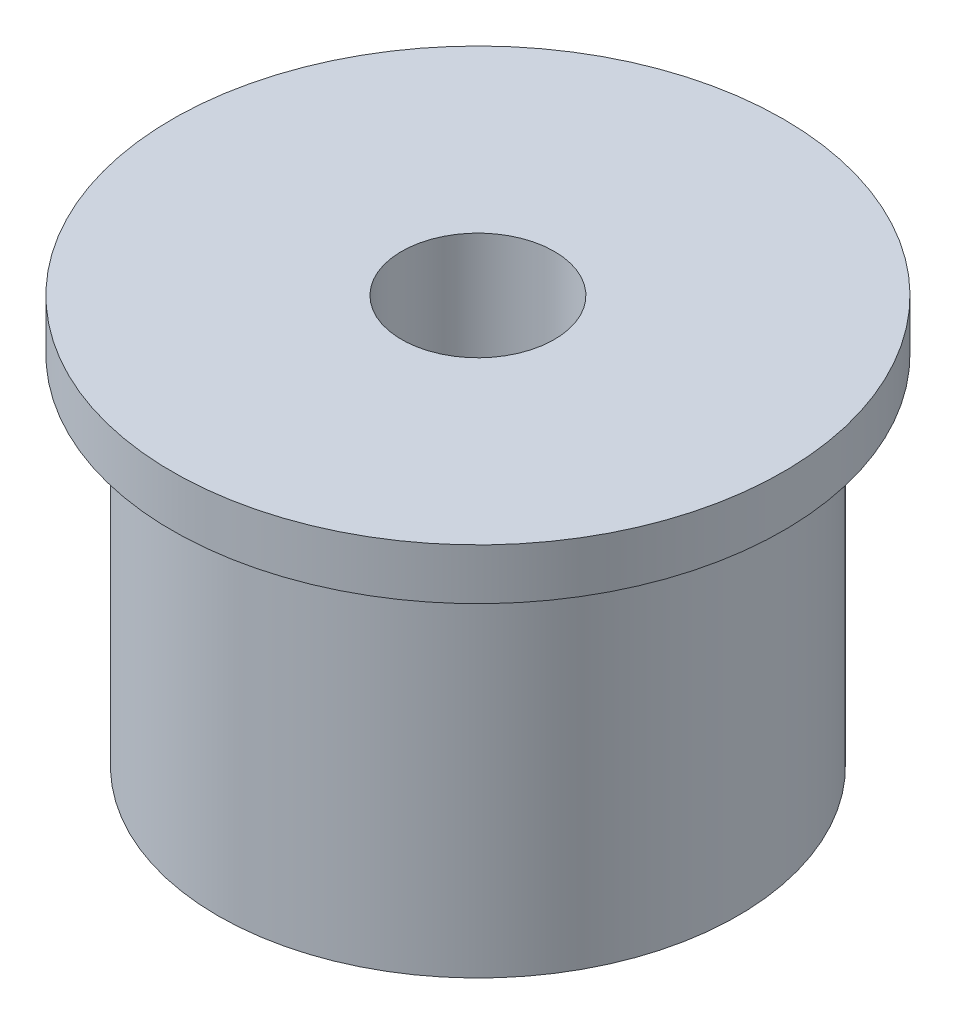
ISO-10303-21;
HEADER;
FILE_DESCRIPTION(('STEP AP214'),'2;1');
FILE_NAME('part.step','',(''),(''),'','','');
FILE_SCHEMA(('AUTOMOTIVE_DESIGN { 1 0 10303 214 1 1 1 1 }'));
ENDSEC;
DATA;
#1=APPLICATION_CONTEXT('core data for automotive mechanical design processes');
#2=APPLICATION_PROTOCOL_DEFINITION('international standard','automotive_design',2000,#1);
#3=PRODUCT_CONTEXT('',#1,'mechanical');
#4=PRODUCT('Part','Part','',(#3));
#5=PRODUCT_RELATED_PRODUCT_CATEGORY('part','',(#4));
#6=PRODUCT_DEFINITION_FORMATION('','',#4);
#7=PRODUCT_DEFINITION_CONTEXT('part definition',#1,'design');
#8=PRODUCT_DEFINITION('design','',#6,#7);
#9=PRODUCT_DEFINITION_SHAPE('','',#8);
#10=(LENGTH_UNIT() NAMED_UNIT(*) SI_UNIT(.MILLI.,.METRE.));
#11=(NAMED_UNIT(*) PLANE_ANGLE_UNIT() SI_UNIT($,.RADIAN.));
#12=(NAMED_UNIT(*) SI_UNIT($,.STERADIAN.) SOLID_ANGLE_UNIT());
#13=UNCERTAINTY_MEASURE_WITH_UNIT(LENGTH_MEASURE(1.E-05),#10,'distance_accuracy_value','');
#14=(GEOMETRIC_REPRESENTATION_CONTEXT(3) GLOBAL_UNCERTAINTY_ASSIGNED_CONTEXT((#13)) GLOBAL_UNIT_ASSIGNED_CONTEXT((#10,
#11,#12)) REPRESENTATION_CONTEXT('',''));
#15=CARTESIAN_POINT('',(0.,0.,0.));
#16=DIRECTION('',(0.,0.,1.));
#17=DIRECTION('',(1.,0.,0.));
#18=AXIS2_PLACEMENT_3D('',#15,#16,#17);
#19=CARTESIAN_POINT('',(-16.2052,0.,0.));
#20=DIRECTION('',(0.,1.,0.));
#21=DIRECTION('',(0.,0.,1.));
#22=AXIS2_PLACEMENT_3D('',#19,#20,#21);
#23=PLANE('',#22);
#24=CARTESIAN_POINT('',(0.,0.,0.));
#25=DIRECTION('',(0.,-1.,0.));
#26=DIRECTION('',(0.,0.,-1.));
#27=AXIS2_PLACEMENT_3D('',#24,#25,#26);
#28=CIRCLE('',#27,4.7625);
#29=CARTESIAN_POINT('',(0.,0.,-4.7625));
#30=VERTEX_POINT('',#29);
#31=EDGE_CURVE('E10',#30,#30,#28,.T.);
#32=ORIENTED_EDGE('',*,*,#31,.F.);
#33=EDGE_LOOP('',(#32));
#34=FACE_BOUND('',#33,.T.);
#35=CARTESIAN_POINT('',(0.,0.,0.));
#36=DIRECTION('',(0.,-1.,0.));
#37=DIRECTION('',(0.,0.,-1.));
#38=AXIS2_PLACEMENT_3D('',#35,#36,#37);
#39=CIRCLE('',#38,16.2052);
#40=CARTESIAN_POINT('',(0.,0.,-16.2052));
#41=VERTEX_POINT('',#40);
#42=EDGE_CURVE('E53',#41,#41,#39,.T.);
#43=ORIENTED_EDGE('',*,*,#42,.T.);
#44=EDGE_LOOP('',(#43));
#45=FACE_BOUND('',#44,.T.);
#46=ADVANCED_FACE('F31',(#34,#45),#23,.F.);
#47=CARTESIAN_POINT('',(0.,0.,0.));
#48=DIRECTION('',(0.,-1.,0.));
#49=DIRECTION('',(0.,0.,-1.));
#50=AXIS2_PLACEMENT_3D('',#47,#48,#49);
#51=CYLINDRICAL_SURFACE('',#50,4.7625);
#52=CARTESIAN_POINT('',(0.,25.4,0.));
#53=DIRECTION('',(0.,-1.,0.));
#54=DIRECTION('',(0.,0.,-1.));
#55=AXIS2_PLACEMENT_3D('',#52,#53,#54);
#56=CIRCLE('',#55,4.7625);
#57=CARTESIAN_POINT('',(0.,25.4,-4.7625));
#58=VERTEX_POINT('',#57);
#59=EDGE_CURVE('E37',#58,#58,#56,.T.);
#60=ORIENTED_EDGE('',*,*,#59,.F.);
#61=EDGE_LOOP('',(#60));
#62=FACE_BOUND('',#61,.T.);
#63=ORIENTED_EDGE('',*,*,#31,.T.);
#64=EDGE_LOOP('',(#63));
#65=FACE_BOUND('',#64,.T.);
#66=ADVANCED_FACE('F78',(#62,#65),#51,.F.);
#67=CARTESIAN_POINT('',(-4.7625,25.4,0.));
#68=DIRECTION('',(0.,-1.,0.));
#69=DIRECTION('',(0.,0.,-1.));
#70=AXIS2_PLACEMENT_3D('',#67,#68,#69);
#71=PLANE('',#70);
#72=CARTESIAN_POINT('',(0.,25.4,0.));
#73=DIRECTION('',(0.,-1.,0.));
#74=DIRECTION('',(0.,0.,-1.));
#75=AXIS2_PLACEMENT_3D('',#72,#73,#74);
#76=CIRCLE('',#75,19.05);
#77=CARTESIAN_POINT('',(0.,25.4,-19.05));
#78=VERTEX_POINT('',#77);
#79=EDGE_CURVE('E41',#78,#78,#76,.T.);
#80=ORIENTED_EDGE('',*,*,#79,.F.);
#81=EDGE_LOOP('',(#80));
#82=FACE_BOUND('',#81,.T.);
#83=ORIENTED_EDGE('',*,*,#59,.T.);
#84=EDGE_LOOP('',(#83));
#85=FACE_BOUND('',#84,.T.);
#86=ADVANCED_FACE('F73',(#82,#85),#71,.F.);
#87=CARTESIAN_POINT('',(0.,0.,0.));
#88=DIRECTION('',(0.,-1.,0.));
#89=DIRECTION('',(0.,0.,-1.));
#90=AXIS2_PLACEMENT_3D('',#87,#88,#89);
#91=CYLINDRICAL_SURFACE('',#90,19.05);
#92=CARTESIAN_POINT('',(0.,22.225,0.));
#93=DIRECTION('',(0.,-1.,0.));
#94=DIRECTION('',(0.,0.,-1.));
#95=AXIS2_PLACEMENT_3D('',#92,#93,#94);
#96=CIRCLE('',#95,19.05);
#97=CARTESIAN_POINT('',(0.,22.225,-19.05));
#98=VERTEX_POINT('',#97);
#99=EDGE_CURVE('E45',#98,#98,#96,.T.);
#100=ORIENTED_EDGE('',*,*,#99,.F.);
#101=EDGE_LOOP('',(#100));
#102=FACE_BOUND('',#101,.T.);
#103=ORIENTED_EDGE('',*,*,#79,.T.);
#104=EDGE_LOOP('',(#103));
#105=FACE_BOUND('',#104,.T.);
#106=ADVANCED_FACE('F67',(#102,#105),#91,.T.);
#107=CARTESIAN_POINT('',(-19.05,22.225,0.));
#108=DIRECTION('',(0.,1.,0.));
#109=DIRECTION('',(0.,0.,1.));
#110=AXIS2_PLACEMENT_3D('',#107,#108,#109);
#111=PLANE('',#110);
#112=CARTESIAN_POINT('',(0.,22.225,0.));
#113=DIRECTION('',(0.,-1.,0.));
#114=DIRECTION('',(0.,0.,-1.));
#115=AXIS2_PLACEMENT_3D('',#112,#113,#114);
#116=CIRCLE('',#115,16.2052);
#117=CARTESIAN_POINT('',(0.,22.225,-16.2052));
#118=VERTEX_POINT('',#117);
#119=EDGE_CURVE('E50',#118,#118,#116,.T.);
#120=ORIENTED_EDGE('',*,*,#119,.F.);
#121=EDGE_LOOP('',(#120));
#122=FACE_BOUND('',#121,.T.);
#123=ORIENTED_EDGE('',*,*,#99,.T.);
#124=EDGE_LOOP('',(#123));
#125=FACE_BOUND('',#124,.T.);
#126=ADVANCED_FACE('F61',(#122,#125),#111,.F.);
#127=CARTESIAN_POINT('',(0.,0.,0.));
#128=DIRECTION('',(0.,-1.,0.));
#129=DIRECTION('',(0.,0.,-1.));
#130=AXIS2_PLACEMENT_3D('',#127,#128,#129);
#131=CYLINDRICAL_SURFACE('',#130,16.2052);
#132=ORIENTED_EDGE('',*,*,#42,.F.);
#133=EDGE_LOOP('',(#132));
#134=FACE_BOUND('',#133,.T.);
#135=ORIENTED_EDGE('',*,*,#119,.T.);
#136=EDGE_LOOP('',(#135));
#137=FACE_BOUND('',#136,.T.);
#138=ADVANCED_FACE('F58',(#134,#137),#131,.T.);
#139=CLOSED_SHELL('',(#46,#66,#86,#106,#126,#138));
#140=MANIFOLD_SOLID_BREP('B2',#139);
#141=ADVANCED_BREP_SHAPE_REPRESENTATION('',(#18,#140),#14);
#142=SHAPE_DEFINITION_REPRESENTATION(#9,#141);
ENDSEC;
END-ISO-10303-21;
